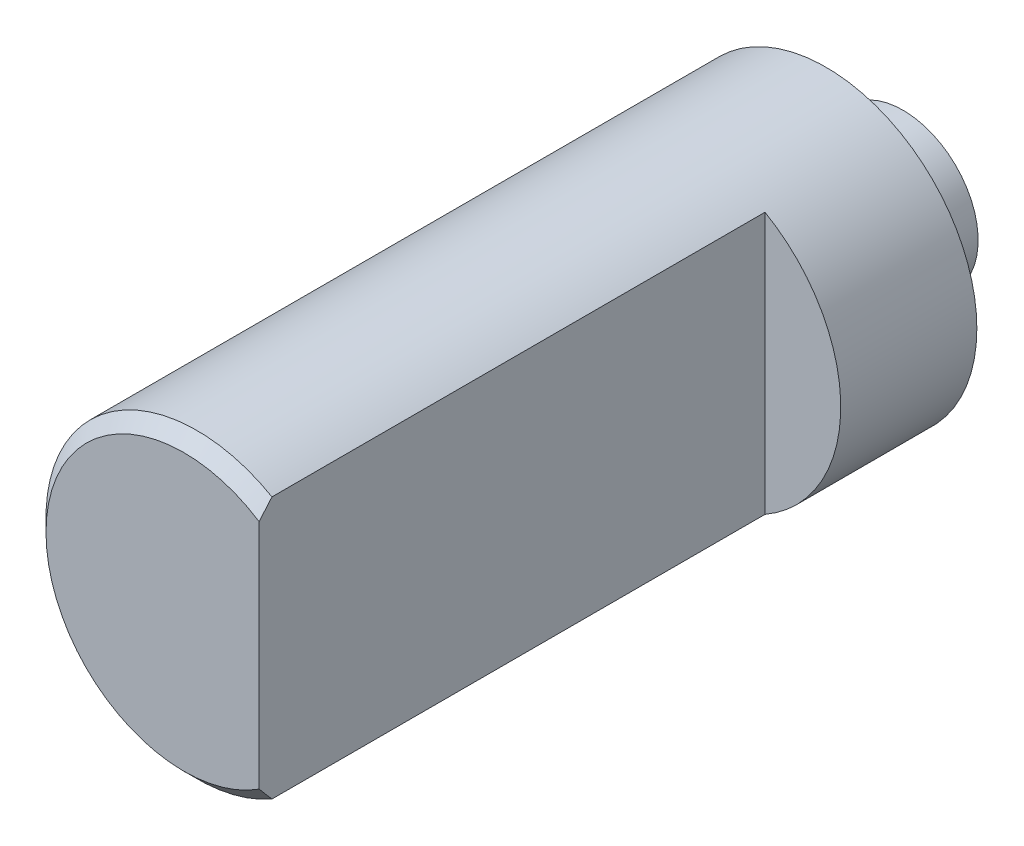
ISO-10303-21;
HEADER;
FILE_DESCRIPTION(('STEP AP214'),'2;1');
FILE_NAME('part.step','',(''),(''),'','','');
FILE_SCHEMA(('AUTOMOTIVE_DESIGN { 1 0 10303 214 1 1 1 1 }'));
ENDSEC;
DATA;
#1=APPLICATION_CONTEXT('core data for automotive mechanical design processes');
#2=APPLICATION_PROTOCOL_DEFINITION('international standard','automotive_design',2000,#1);
#3=PRODUCT_CONTEXT('',#1,'mechanical');
#4=PRODUCT('Part','Part','',(#3));
#5=PRODUCT_RELATED_PRODUCT_CATEGORY('part','',(#4));
#6=PRODUCT_DEFINITION_FORMATION('','',#4);
#7=PRODUCT_DEFINITION_CONTEXT('part definition',#1,'design');
#8=PRODUCT_DEFINITION('design','',#6,#7);
#9=PRODUCT_DEFINITION_SHAPE('','',#8);
#10=(LENGTH_UNIT() NAMED_UNIT(*) SI_UNIT(.MILLI.,.METRE.));
#11=(NAMED_UNIT(*) PLANE_ANGLE_UNIT() SI_UNIT($,.RADIAN.));
#12=(NAMED_UNIT(*) SI_UNIT($,.STERADIAN.) SOLID_ANGLE_UNIT());
#13=UNCERTAINTY_MEASURE_WITH_UNIT(LENGTH_MEASURE(1.E-05),#10,'distance_accuracy_value','');
#14=(GEOMETRIC_REPRESENTATION_CONTEXT(3) GLOBAL_UNCERTAINTY_ASSIGNED_CONTEXT((#13)) GLOBAL_UNIT_ASSIGNED_CONTEXT((#10,
#11,#12)) REPRESENTATION_CONTEXT('',''));
#15=CARTESIAN_POINT('',(0.,0.,0.));
#16=DIRECTION('',(0.,0.,1.));
#17=DIRECTION('',(1.,0.,0.));
#18=AXIS2_PLACEMENT_3D('',#15,#16,#17);
#19=CARTESIAN_POINT('',(0.,0.,0.));
#20=DIRECTION('',(0.,0.,1.));
#21=DIRECTION('',(1.,0.,0.));
#22=AXIS2_PLACEMENT_3D('',#19,#20,#21);
#23=PLANE('',#22);
#24=CARTESIAN_POINT('',(0.,0.,0.));
#25=DIRECTION('',(0.,0.,-1.));
#26=DIRECTION('',(-1.,0.,0.));
#27=AXIS2_PLACEMENT_3D('',#24,#25,#26);
#28=CIRCLE('',#27,2.9845);
#29=CARTESIAN_POINT('',(2.9845,0.,0.));
#30=VERTEX_POINT('',#29);
#31=EDGE_CURVE('E11',#30,#30,#28,.T.);
#32=ORIENTED_EDGE('',*,*,#31,.T.);
#33=EDGE_LOOP('',(#32));
#34=FACE_BOUND('',#33,.T.);
#35=CARTESIAN_POINT('',(0.,0.,0.));
#36=DIRECTION('',(0.,0.,1.));
#37=DIRECTION('',(1.,0.,0.));
#38=AXIS2_PLACEMENT_3D('',#35,#36,#37);
#39=CIRCLE('',#38,1.4859);
#40=CARTESIAN_POINT('',(-1.4859,0.,0.));
#41=VERTEX_POINT('',#40);
#42=EDGE_CURVE('E103',#41,#41,#39,.T.);
#43=ORIENTED_EDGE('',*,*,#42,.T.);
#44=EDGE_LOOP('',(#43));
#45=FACE_BOUND('',#44,.T.);
#46=ADVANCED_FACE('F17',(#34,#45),#23,.F.);
#47=CARTESIAN_POINT('',(0.,0.,0.));
#48=DIRECTION('',(0.,0.,1.));
#49=DIRECTION('',(-1.,0.,0.));
#50=AXIS2_PLACEMENT_3D('',#47,#48,#49);
#51=CYLINDRICAL_SURFACE('',#50,2.9845);
#52=ORIENTED_EDGE('',*,*,#31,.F.);
#53=EDGE_LOOP('',(#52));
#54=FACE_BOUND('',#53,.T.);
#55=CARTESIAN_POINT('',(0.,0.,12.446));
#56=DIRECTION('',(0.,0.,1.));
#57=DIRECTION('',(-1.,0.,0.));
#58=AXIS2_PLACEMENT_3D('',#55,#56,#57);
#59=CIRCLE('',#58,2.9845);
#60=CARTESIAN_POINT('',(1.4859,2.58830860602054,12.446));
#61=VERTEX_POINT('',#60);
#62=CARTESIAN_POINT('',(1.4859,-2.58830860602054,12.446));
#63=VERTEX_POINT('',#62);
#64=EDGE_CURVE('E81',#61,#63,#59,.T.);
#65=ORIENTED_EDGE('',*,*,#64,.F.);
#66=DIRECTION('',(0.,0.,-1.));
#67=VECTOR('',#66,1.);
#68=CARTESIAN_POINT('',(1.4859,2.58830860602054,0.));
#69=LINE('',#68,#67);
#70=CARTESIAN_POINT('',(1.4859,2.58830860602054,2.6924));
#71=VERTEX_POINT('',#70);
#72=EDGE_CURVE('E88',#61,#71,#69,.T.);
#73=ORIENTED_EDGE('',*,*,#72,.T.);
#74=CARTESIAN_POINT('',(0.,0.,2.6924));
#75=DIRECTION('',(0.,0.,-1.));
#76=DIRECTION('',(-1.,0.,0.));
#77=AXIS2_PLACEMENT_3D('',#74,#75,#76);
#78=CIRCLE('',#77,2.9845);
#79=CARTESIAN_POINT('',(1.4859,-2.58830860602054,2.6924));
#80=VERTEX_POINT('',#79);
#81=EDGE_CURVE('E30',#71,#80,#78,.T.);
#82=ORIENTED_EDGE('',*,*,#81,.T.);
#83=DIRECTION('',(0.,0.,1.));
#84=VECTOR('',#83,1.);
#85=CARTESIAN_POINT('',(1.4859,-2.58830860602054,0.));
#86=LINE('',#85,#84);
#87=EDGE_CURVE('E101',#80,#63,#86,.T.);
#88=ORIENTED_EDGE('',*,*,#87,.T.);
#89=EDGE_LOOP('',(#65,#73,#82,#88));
#90=FACE_BOUND('',#89,.T.);
#91=ADVANCED_FACE('F109',(#54,#90),#51,.T.);
#92=CARTESIAN_POINT('',(1.95219029163046,0.,2.6924));
#93=DIRECTION('',(0.,0.,1.));
#94=DIRECTION('',(1.,0.,0.));
#95=AXIS2_PLACEMENT_3D('',#92,#93,#94);
#96=PLANE('',#95);
#97=DIRECTION('',(0.,1.,0.));
#98=VECTOR('',#97,1.);
#99=CARTESIAN_POINT('',(1.4859,2.58830860602054,2.6924));
#100=LINE('',#99,#98);
#101=EDGE_CURVE('E102',#80,#71,#100,.T.);
#102=ORIENTED_EDGE('',*,*,#101,.F.);
#103=ORIENTED_EDGE('',*,*,#81,.F.);
#104=EDGE_LOOP('',(#102,#103));
#105=FACE_BOUND('',#104,.T.);
#106=ADVANCED_FACE('F113',(#105),#96,.T.);
#107=CARTESIAN_POINT('',(1.4859,-2.58830860602054,12.7));
#108=DIRECTION('',(-1.,0.,0.));
#109=DIRECTION('',(0.,0.,1.));
#110=AXIS2_PLACEMENT_3D('',#107,#108,#109);
#111=PLANE('',#110);
#112=CARTESIAN_POINT('',(1.4859,2.29079275361172,12.7));
#113=CARTESIAN_POINT('',(1.4859,2.43293921642927,12.5807441541937));
#114=CARTESIAN_POINT('',(1.4859,2.58830860602054,12.446));
#115=(BOUNDED_CURVE() B_SPLINE_CURVE(2,(#112,#113,#114),.UNSPECIFIED.,.F.,
.F.) B_SPLINE_CURVE_WITH_KNOTS((3,3),(0.,0.0848456627367197),
.UNSPECIFIED.) CURVE() GEOMETRIC_REPRESENTATION_ITEM() RATIONAL_B_SPLINE_CURVE((1.,
1.02041758080578,1.03843012623545)) REPRESENTATION_ITEM(''));
#116=CARTESIAN_POINT('',(1.4859,2.29079275361173,12.7));
#117=VERTEX_POINT('',#116);
#118=EDGE_CURVE('E84',#117,#61,#115,.T.);
#119=ORIENTED_EDGE('',*,*,#118,.F.);
#120=DIRECTION('',(0.,1.,0.));
#121=VECTOR('',#120,1.);
#122=CARTESIAN_POINT('',(1.4859,-1.29415430301027,12.7));
#123=LINE('',#122,#121);
#124=CARTESIAN_POINT('',(1.4859,-2.29079275361173,12.7));
#125=VERTEX_POINT('',#124);
#126=EDGE_CURVE('E70',#125,#117,#123,.T.);
#127=ORIENTED_EDGE('',*,*,#126,.F.);
#128=CARTESIAN_POINT('',(1.4859,-2.58830860602054,12.446));
#129=CARTESIAN_POINT('',(1.4859,-2.43293921642929,12.5807441541937));
#130=CARTESIAN_POINT('',(1.4859,-2.29079275361172,12.7));
#131=(BOUNDED_CURVE() B_SPLINE_CURVE(2,(#128,#129,#130),.UNSPECIFIED.,.F.,
.F.) B_SPLINE_CURVE_WITH_KNOTS((3,3),(1.35575117185286,1.44059683458957),
.UNSPECIFIED.) CURVE() GEOMETRIC_REPRESENTATION_ITEM() RATIONAL_B_SPLINE_CURVE((1.03843012623545,
1.02041758080578,1.)) REPRESENTATION_ITEM(''));
#132=EDGE_CURVE('E21',#63,#125,#131,.T.);
#133=ORIENTED_EDGE('',*,*,#132,.F.);
#134=ORIENTED_EDGE('',*,*,#87,.F.);
#135=ORIENTED_EDGE('',*,*,#101,.T.);
#136=ORIENTED_EDGE('',*,*,#72,.F.);
#137=EDGE_LOOP('',(#119,#127,#133,#134,#135,#136));
#138=FACE_BOUND('',#137,.T.);
#139=ADVANCED_FACE('F85',(#138),#111,.F.);
#140=CARTESIAN_POINT('',(0.,0.,-1.524));
#141=DIRECTION('',(0.,0.,1.));
#142=DIRECTION('',(1.,0.,0.));
#143=AXIS2_PLACEMENT_3D('',#140,#141,#142);
#144=PLANE('',#143);
#145=CARTESIAN_POINT('',(0.,0.,-1.524));
#146=DIRECTION('',(0.,0.,-1.));
#147=DIRECTION('',(1.,0.,0.));
#148=AXIS2_PLACEMENT_3D('',#145,#146,#147);
#149=CIRCLE('',#148,1.4859);
#150=CARTESIAN_POINT('',(-1.4859,0.,-1.524));
#151=VERTEX_POINT('',#150);
#152=EDGE_CURVE('E80',#151,#151,#149,.T.);
#153=ORIENTED_EDGE('',*,*,#152,.T.);
#154=EDGE_LOOP('',(#153));
#155=FACE_BOUND('',#154,.T.);
#156=ADVANCED_FACE('F135',(#155),#144,.F.);
#157=CARTESIAN_POINT('',(0.,0.,0.));
#158=DIRECTION('',(0.,0.,-1.));
#159=DIRECTION('',(1.,0.,0.));
#160=AXIS2_PLACEMENT_3D('',#157,#158,#159);
#161=CYLINDRICAL_SURFACE('',#160,1.4859);
#162=ORIENTED_EDGE('',*,*,#42,.F.);
#163=EDGE_LOOP('',(#162));
#164=FACE_BOUND('',#163,.T.);
#165=ORIENTED_EDGE('',*,*,#152,.F.);
#166=EDGE_LOOP('',(#165));
#167=FACE_BOUND('',#166,.T.);
#168=ADVANCED_FACE('F19',(#164,#167),#161,.T.);
#169=CARTESIAN_POINT('',(0.,0.,12.7));
#170=DIRECTION('',(0.,0.,1.));
#171=DIRECTION('',(1.,0.,0.));
#172=AXIS2_PLACEMENT_3D('',#169,#170,#171);
#173=PLANE('',#172);
#174=CARTESIAN_POINT('',(0.,0.,12.7));
#175=DIRECTION('',(0.,0.,-1.));
#176=DIRECTION('',(-1.,0.,0.));
#177=AXIS2_PLACEMENT_3D('',#174,#175,#176);
#178=CIRCLE('',#177,2.7305);
#179=EDGE_CURVE('E77',#125,#117,#178,.T.);
#180=ORIENTED_EDGE('',*,*,#179,.F.);
#181=ORIENTED_EDGE('',*,*,#126,.T.);
#182=EDGE_LOOP('',(#180,#181));
#183=FACE_BOUND('',#182,.T.);
#184=ADVANCED_FACE('F75',(#183),#173,.T.);
#185=CARTESIAN_POINT('',(0.,0.,12.573));
#186=DIRECTION('',(0.,0.,-1.));
#187=DIRECTION('',(-1.,0.,0.));
#188=AXIS2_PLACEMENT_3D('',#185,#186,#187);
#189=CONICAL_SURFACE('',#188,2.8575,0.785398163399998);
#190=ORIENTED_EDGE('',*,*,#132,.T.);
#191=ORIENTED_EDGE('',*,*,#179,.T.);
#192=ORIENTED_EDGE('',*,*,#118,.T.);
#193=ORIENTED_EDGE('',*,*,#64,.T.);
#194=EDGE_LOOP('',(#190,#191,#192,#193));
#195=FACE_BOUND('',#194,.T.);
#196=ADVANCED_FACE('F94',(#195),#189,.T.);
#197=CLOSED_SHELL('',(#46,#91,#106,#139,#156,#168,#184,#196));
#198=MANIFOLD_SOLID_BREP('B1',#197);
#199=ADVANCED_BREP_SHAPE_REPRESENTATION('',(#18,#198),#14);
#200=SHAPE_DEFINITION_REPRESENTATION(#9,#199);
ENDSEC;
END-ISO-10303-21;
